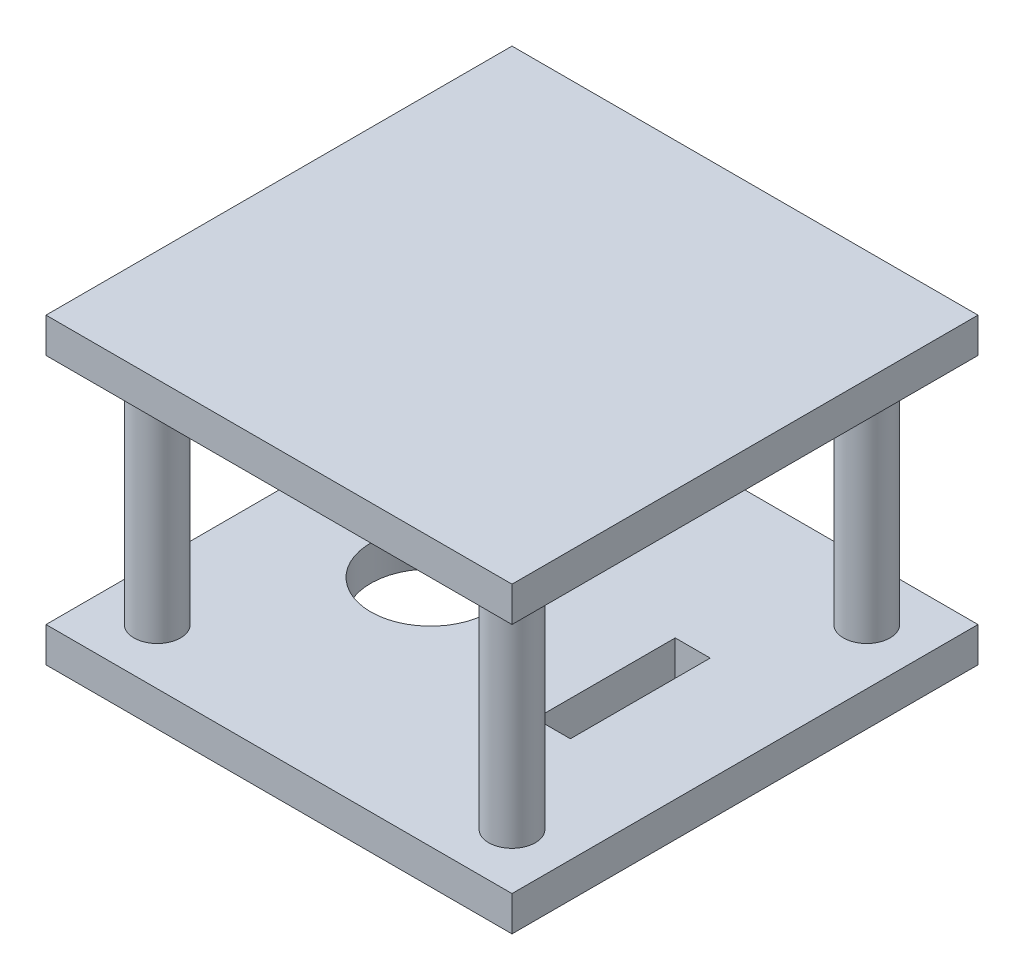
ISO-10303-21;
HEADER;
FILE_DESCRIPTION(('STEP AP214'),'2;1');
FILE_NAME('part.step','',(''),(''),'','','');
FILE_SCHEMA(('AUTOMOTIVE_DESIGN { 1 0 10303 214 1 1 1 1 }'));
ENDSEC;
DATA;
#1=APPLICATION_CONTEXT('core data for automotive mechanical design processes');
#2=APPLICATION_PROTOCOL_DEFINITION('international standard','automotive_design',2000,#1);
#3=PRODUCT_CONTEXT('',#1,'mechanical');
#4=PRODUCT('Part','Part','',(#3));
#5=PRODUCT_RELATED_PRODUCT_CATEGORY('part','',(#4));
#6=PRODUCT_DEFINITION_FORMATION('','',#4);
#7=PRODUCT_DEFINITION_CONTEXT('part definition',#1,'design');
#8=PRODUCT_DEFINITION('design','',#6,#7);
#9=PRODUCT_DEFINITION_SHAPE('','',#8);
#10=(LENGTH_UNIT() NAMED_UNIT(*) SI_UNIT(.MILLI.,.METRE.));
#11=(NAMED_UNIT(*) PLANE_ANGLE_UNIT() SI_UNIT($,.RADIAN.));
#12=(NAMED_UNIT(*) SI_UNIT($,.STERADIAN.) SOLID_ANGLE_UNIT());
#13=UNCERTAINTY_MEASURE_WITH_UNIT(LENGTH_MEASURE(1.E-05),#10,'distance_accuracy_value','');
#14=(GEOMETRIC_REPRESENTATION_CONTEXT(3) GLOBAL_UNCERTAINTY_ASSIGNED_CONTEXT((#13)) GLOBAL_UNIT_ASSIGNED_CONTEXT((#10,
#11,#12)) REPRESENTATION_CONTEXT('',''));
#15=CARTESIAN_POINT('',(0.,0.,0.));
#16=DIRECTION('',(0.,0.,1.));
#17=DIRECTION('',(1.,0.,0.));
#18=AXIS2_PLACEMENT_3D('',#15,#16,#17);
#19=CARTESIAN_POINT('',(-20.,3.,20.));
#20=DIRECTION('',(0.,0.,-1.));
#21=DIRECTION('',(-1.,0.,0.));
#22=AXIS2_PLACEMENT_3D('',#19,#20,#21);
#23=PLANE('',#22);
#24=DIRECTION('',(1.,0.,0.));
#25=VECTOR('',#24,1.);
#26=CARTESIAN_POINT('',(-20.,0.,20.));
#27=LINE('',#26,#25);
#28=CARTESIAN_POINT('',(-20.,0.,20.));
#29=VERTEX_POINT('',#28);
#30=CARTESIAN_POINT('',(20.,0.,20.));
#31=VERTEX_POINT('',#30);
#32=EDGE_CURVE('E214',#29,#31,#27,.T.);
#33=ORIENTED_EDGE('',*,*,#32,.T.);
#34=DIRECTION('',(0.,-1.,0.));
#35=VECTOR('',#34,1.);
#36=CARTESIAN_POINT('',(20.,3.,20.));
#37=LINE('',#36,#35);
#38=CARTESIAN_POINT('',(20.,3.,20.));
#39=VERTEX_POINT('',#38);
#40=EDGE_CURVE('E243',#39,#31,#37,.T.);
#41=ORIENTED_EDGE('',*,*,#40,.F.);
#42=DIRECTION('',(1.,0.,0.));
#43=VECTOR('',#42,1.);
#44=CARTESIAN_POINT('',(-20.,3.,20.));
#45=LINE('',#44,#43);
#46=CARTESIAN_POINT('',(-20.,3.,20.));
#47=VERTEX_POINT('',#46);
#48=EDGE_CURVE('E215',#47,#39,#45,.T.);
#49=ORIENTED_EDGE('',*,*,#48,.F.);
#50=DIRECTION('',(0.,-1.,0.));
#51=VECTOR('',#50,1.);
#52=CARTESIAN_POINT('',(-20.,3.,20.));
#53=LINE('',#52,#51);
#54=EDGE_CURVE('E227',#47,#29,#53,.T.);
#55=ORIENTED_EDGE('',*,*,#54,.T.);
#56=EDGE_LOOP('',(#33,#41,#49,#55));
#57=FACE_BOUND('',#56,.T.);
#58=ADVANCED_FACE('F39',(#57),#23,.F.);
#59=CARTESIAN_POINT('',(20.,3.,20.));
#60=DIRECTION('',(-1.,0.,0.));
#61=DIRECTION('',(0.,0.,1.));
#62=AXIS2_PLACEMENT_3D('',#59,#60,#61);
#63=PLANE('',#62);
#64=DIRECTION('',(0.,0.,-1.));
#65=VECTOR('',#64,1.);
#66=CARTESIAN_POINT('',(20.,0.,20.));
#67=LINE('',#66,#65);
#68=CARTESIAN_POINT('',(20.,0.,-20.));
#69=VERTEX_POINT('',#68);
#70=EDGE_CURVE('E230',#31,#69,#67,.T.);
#71=ORIENTED_EDGE('',*,*,#70,.T.);
#72=DIRECTION('',(0.,-1.,0.));
#73=VECTOR('',#72,1.);
#74=CARTESIAN_POINT('',(20.,3.,-20.));
#75=LINE('',#74,#73);
#76=CARTESIAN_POINT('',(20.,3.,-20.));
#77=VERTEX_POINT('',#76);
#78=EDGE_CURVE('E241',#77,#69,#75,.T.);
#79=ORIENTED_EDGE('',*,*,#78,.F.);
#80=DIRECTION('',(0.,0.,-1.));
#81=VECTOR('',#80,1.);
#82=CARTESIAN_POINT('',(20.,3.,20.));
#83=LINE('',#82,#81);
#84=EDGE_CURVE('E218',#39,#77,#83,.T.);
#85=ORIENTED_EDGE('',*,*,#84,.F.);
#86=ORIENTED_EDGE('',*,*,#40,.T.);
#87=EDGE_LOOP('',(#71,#79,#85,#86));
#88=FACE_BOUND('',#87,.T.);
#89=ADVANCED_FACE('F283',(#88),#63,.F.);
#90=CARTESIAN_POINT('',(-20.,3.,-20.));
#91=DIRECTION('',(0.,0.,-1.));
#92=DIRECTION('',(-1.,0.,0.));
#93=AXIS2_PLACEMENT_3D('',#90,#91,#92);
#94=PLANE('',#93);
#95=DIRECTION('',(1.,0.,0.));
#96=VECTOR('',#95,1.);
#97=CARTESIAN_POINT('',(-20.,0.,-20.));
#98=LINE('',#97,#96);
#99=CARTESIAN_POINT('',(-20.,0.,-20.));
#100=VERTEX_POINT('',#99);
#101=EDGE_CURVE('E233',#100,#69,#98,.T.);
#102=ORIENTED_EDGE('',*,*,#101,.F.);
#103=DIRECTION('',(0.,-1.,0.));
#104=VECTOR('',#103,1.);
#105=CARTESIAN_POINT('',(-20.,3.,-20.));
#106=LINE('',#105,#104);
#107=CARTESIAN_POINT('',(-20.,3.,-20.));
#108=VERTEX_POINT('',#107);
#109=EDGE_CURVE('E239',#108,#100,#106,.T.);
#110=ORIENTED_EDGE('',*,*,#109,.F.);
#111=DIRECTION('',(1.,0.,0.));
#112=VECTOR('',#111,1.);
#113=CARTESIAN_POINT('',(-20.,3.,-20.));
#114=LINE('',#113,#112);
#115=EDGE_CURVE('E221',#108,#77,#114,.T.);
#116=ORIENTED_EDGE('',*,*,#115,.T.);
#117=ORIENTED_EDGE('',*,*,#78,.T.);
#118=EDGE_LOOP('',(#102,#110,#116,#117));
#119=FACE_BOUND('',#118,.T.);
#120=ADVANCED_FACE('F280',(#119),#94,.T.);
#121=CARTESIAN_POINT('',(-20.,3.,20.));
#122=DIRECTION('',(-1.,0.,0.));
#123=DIRECTION('',(0.,0.,1.));
#124=AXIS2_PLACEMENT_3D('',#121,#122,#123);
#125=PLANE('',#124);
#126=DIRECTION('',(0.,0.,-1.));
#127=VECTOR('',#126,1.);
#128=CARTESIAN_POINT('',(-20.,0.,20.));
#129=LINE('',#128,#127);
#130=EDGE_CURVE('E219',#29,#100,#129,.T.);
#131=ORIENTED_EDGE('',*,*,#130,.F.);
#132=ORIENTED_EDGE('',*,*,#54,.F.);
#133=DIRECTION('',(0.,0.,-1.));
#134=VECTOR('',#133,1.);
#135=CARTESIAN_POINT('',(-20.,3.,20.));
#136=LINE('',#135,#134);
#137=EDGE_CURVE('E224',#47,#108,#136,.T.);
#138=ORIENTED_EDGE('',*,*,#137,.T.);
#139=ORIENTED_EDGE('',*,*,#109,.T.);
#140=EDGE_LOOP('',(#131,#132,#138,#139));
#141=FACE_BOUND('',#140,.T.);
#142=ADVANCED_FACE('F274',(#141),#125,.T.);
#143=CARTESIAN_POINT('',(0.,3.,0.));
#144=DIRECTION('',(0.,1.,0.));
#145=DIRECTION('',(0.,0.,1.));
#146=AXIS2_PLACEMENT_3D('',#143,#144,#145);
#147=PLANE('',#146);
#148=CARTESIAN_POINT('',(15.2247989874837,3.,15.2247989874837));
#149=DIRECTION('',(0.,1.,0.));
#150=DIRECTION('',(0.,0.,1.));
#151=AXIS2_PLACEMENT_3D('',#148,#149,#150);
#152=CIRCLE('',#151,2.);
#153=CARTESIAN_POINT('',(15.2247989874837,3.,17.2247989874837));
#154=VERTEX_POINT('',#153);
#155=EDGE_CURVE('E197',#154,#154,#152,.T.);
#156=ORIENTED_EDGE('',*,*,#155,.F.);
#157=EDGE_LOOP('',(#156));
#158=FACE_BOUND('',#157,.T.);
#159=CARTESIAN_POINT('',(15.2247989874837,3.,-15.2247989874837));
#160=DIRECTION('',(0.,1.,0.));
#161=DIRECTION('',(0.,0.,1.));
#162=AXIS2_PLACEMENT_3D('',#159,#160,#161);
#163=CIRCLE('',#162,2.);
#164=CARTESIAN_POINT('',(15.2247989874837,3.,-13.2247989874837));
#165=VERTEX_POINT('',#164);
#166=EDGE_CURVE('E201',#165,#165,#163,.T.);
#167=ORIENTED_EDGE('',*,*,#166,.F.);
#168=EDGE_LOOP('',(#167));
#169=FACE_BOUND('',#168,.T.);
#170=CARTESIAN_POINT('',(-15.2247989874837,3.,-15.2247989874837));
#171=DIRECTION('',(0.,1.,0.));
#172=DIRECTION('',(0.,0.,1.));
#173=AXIS2_PLACEMENT_3D('',#170,#171,#172);
#174=CIRCLE('',#173,2.);
#175=CARTESIAN_POINT('',(-15.2247989874837,3.,-13.2247989874837));
#176=VERTEX_POINT('',#175);
#177=EDGE_CURVE('E204',#176,#176,#174,.T.);
#178=ORIENTED_EDGE('',*,*,#177,.F.);
#179=EDGE_LOOP('',(#178));
#180=FACE_BOUND('',#179,.T.);
#181=CARTESIAN_POINT('',(-7.,3.,0.));
#182=DIRECTION('',(0.,1.,0.));
#183=DIRECTION('',(0.,0.,1.));
#184=AXIS2_PLACEMENT_3D('',#181,#182,#183);
#185=CIRCLE('',#184,5.125);
#186=CARTESIAN_POINT('',(-7.,3.,5.125));
#187=VERTEX_POINT('',#186);
#188=EDGE_CURVE('E207',#187,#187,#185,.T.);
#189=ORIENTED_EDGE('',*,*,#188,.F.);
#190=EDGE_LOOP('',(#189));
#191=FACE_BOUND('',#190,.T.);
#192=DIRECTION('',(1.,0.,0.));
#193=VECTOR('',#192,1.);
#194=CARTESIAN_POINT('',(8.,3.,5.9883944628134));
#195=LINE('',#194,#193);
#196=CARTESIAN_POINT('',(8.,3.,5.9883944628134));
#197=VERTEX_POINT('',#196);
#198=CARTESIAN_POINT('',(11.,3.,5.9883944628134));
#199=VERTEX_POINT('',#198);
#200=EDGE_CURVE('E173',#197,#199,#195,.T.);
#201=ORIENTED_EDGE('',*,*,#200,.F.);
#202=DIRECTION('',(0.,0.,1.));
#203=VECTOR('',#202,1.);
#204=CARTESIAN_POINT('',(8.,3.,-6.0116055371866));
#205=LINE('',#204,#203);
#206=CARTESIAN_POINT('',(8.,3.,-6.0116055371866));
#207=VERTEX_POINT('',#206);
#208=EDGE_CURVE('E171',#207,#197,#205,.T.);
#209=ORIENTED_EDGE('',*,*,#208,.F.);
#210=DIRECTION('',(-1.,0.,0.));
#211=VECTOR('',#210,1.);
#212=CARTESIAN_POINT('',(8.,3.,-6.0116055371866));
#213=LINE('',#212,#211);
#214=CARTESIAN_POINT('',(11.,3.,-6.0116055371866));
#215=VERTEX_POINT('',#214);
#216=EDGE_CURVE('E178',#215,#207,#213,.T.);
#217=ORIENTED_EDGE('',*,*,#216,.F.);
#218=DIRECTION('',(0.,0.,-1.));
#219=VECTOR('',#218,1.);
#220=CARTESIAN_POINT('',(11.,3.,-6.0116055371866));
#221=LINE('',#220,#219);
#222=EDGE_CURVE('E176',#199,#215,#221,.T.);
#223=ORIENTED_EDGE('',*,*,#222,.F.);
#224=EDGE_LOOP('',(#201,#209,#217,#223));
#225=FACE_BOUND('',#224,.T.);
#226=CARTESIAN_POINT('',(-15.2247989874837,3.,15.2247989874837));
#227=DIRECTION('',(0.,1.,0.));
#228=DIRECTION('',(0.,0.,1.));
#229=AXIS2_PLACEMENT_3D('',#226,#227,#228);
#230=CIRCLE('',#229,2.);
#231=CARTESIAN_POINT('',(-15.2247989874837,3.,17.2247989874837));
#232=VERTEX_POINT('',#231);
#233=EDGE_CURVE('E200',#232,#232,#230,.T.);
#234=ORIENTED_EDGE('',*,*,#233,.F.);
#235=EDGE_LOOP('',(#234));
#236=FACE_BOUND('',#235,.T.);
#237=ORIENTED_EDGE('',*,*,#48,.T.);
#238=ORIENTED_EDGE('',*,*,#84,.T.);
#239=ORIENTED_EDGE('',*,*,#115,.F.);
#240=ORIENTED_EDGE('',*,*,#137,.F.);
#241=EDGE_LOOP('',(#237,#238,#239,#240));
#242=FACE_BOUND('',#241,.T.);
#243=ADVANCED_FACE('F257',(#158,#169,#180,#191,#225,#236,#242),#147,.T.);
#244=CARTESIAN_POINT('',(0.,0.,0.));
#245=DIRECTION('',(0.,1.,0.));
#246=DIRECTION('',(0.,0.,1.));
#247=AXIS2_PLACEMENT_3D('',#244,#245,#246);
#248=PLANE('',#247);
#249=CARTESIAN_POINT('',(15.2247989874837,0.,15.2247989874837));
#250=DIRECTION('',(0.,1.,0.));
#251=DIRECTION('',(0.,0.,1.));
#252=AXIS2_PLACEMENT_3D('',#249,#250,#251);
#253=CIRCLE('',#252,2.);
#254=CARTESIAN_POINT('',(15.2247989874837,0.,17.2247989874837));
#255=VERTEX_POINT('',#254);
#256=EDGE_CURVE('E11',#255,#255,#253,.F.);
#257=ORIENTED_EDGE('',*,*,#256,.F.);
#258=EDGE_LOOP('',(#257));
#259=FACE_BOUND('',#258,.T.);
#260=CARTESIAN_POINT('',(-15.2247989874837,0.,15.2247989874837));
#261=DIRECTION('',(0.,1.,0.));
#262=DIRECTION('',(0.,0.,1.));
#263=AXIS2_PLACEMENT_3D('',#260,#261,#262);
#264=CIRCLE('',#263,2.);
#265=CARTESIAN_POINT('',(-15.2247989874837,0.,17.2247989874837));
#266=VERTEX_POINT('',#265);
#267=EDGE_CURVE('E46',#266,#266,#264,.F.);
#268=ORIENTED_EDGE('',*,*,#267,.F.);
#269=EDGE_LOOP('',(#268));
#270=FACE_BOUND('',#269,.T.);
#271=CARTESIAN_POINT('',(-15.2247989874837,0.,-15.2247989874837));
#272=DIRECTION('',(0.,1.,0.));
#273=DIRECTION('',(0.,0.,1.));
#274=AXIS2_PLACEMENT_3D('',#271,#272,#273);
#275=CIRCLE('',#274,2.);
#276=CARTESIAN_POINT('',(-15.2247989874837,0.,-13.2247989874837));
#277=VERTEX_POINT('',#276);
#278=EDGE_CURVE('E246',#277,#277,#275,.F.);
#279=ORIENTED_EDGE('',*,*,#278,.F.);
#280=EDGE_LOOP('',(#279));
#281=FACE_BOUND('',#280,.T.);
#282=CARTESIAN_POINT('',(15.2247989874837,0.,-15.2247989874837));
#283=DIRECTION('',(0.,1.,0.));
#284=DIRECTION('',(0.,0.,1.));
#285=AXIS2_PLACEMENT_3D('',#282,#283,#284);
#286=CIRCLE('',#285,2.);
#287=CARTESIAN_POINT('',(15.2247989874837,0.,-13.2247989874837));
#288=VERTEX_POINT('',#287);
#289=EDGE_CURVE('E265',#288,#288,#286,.T.);
#290=ORIENTED_EDGE('',*,*,#289,.T.);
#291=EDGE_LOOP('',(#290));
#292=FACE_BOUND('',#291,.T.);
#293=CARTESIAN_POINT('',(-7.,0.,0.));
#294=DIRECTION('',(0.,1.,0.));
#295=DIRECTION('',(0.,0.,1.));
#296=AXIS2_PLACEMENT_3D('',#293,#294,#295);
#297=CIRCLE('',#296,5.125);
#298=CARTESIAN_POINT('',(-7.,0.,5.125));
#299=VERTEX_POINT('',#298);
#300=EDGE_CURVE('E196',#299,#299,#297,.T.);
#301=ORIENTED_EDGE('',*,*,#300,.T.);
#302=EDGE_LOOP('',(#301));
#303=FACE_BOUND('',#302,.T.);
#304=DIRECTION('',(0.,0.,1.));
#305=VECTOR('',#304,1.);
#306=CARTESIAN_POINT('',(8.,0.,-6.0116055371866));
#307=LINE('',#306,#305);
#308=CARTESIAN_POINT('',(8.,0.,-6.0116055371866));
#309=VERTEX_POINT('',#308);
#310=CARTESIAN_POINT('',(8.,0.,5.9883944628134));
#311=VERTEX_POINT('',#310);
#312=EDGE_CURVE('E61',#309,#311,#307,.T.);
#313=ORIENTED_EDGE('',*,*,#312,.T.);
#314=DIRECTION('',(1.,0.,0.));
#315=VECTOR('',#314,1.);
#316=CARTESIAN_POINT('',(8.,0.,5.9883944628134));
#317=LINE('',#316,#315);
#318=CARTESIAN_POINT('',(11.,0.,5.9883944628134));
#319=VERTEX_POINT('',#318);
#320=EDGE_CURVE('E182',#311,#319,#317,.T.);
#321=ORIENTED_EDGE('',*,*,#320,.T.);
#322=DIRECTION('',(0.,0.,-1.));
#323=VECTOR('',#322,1.);
#324=CARTESIAN_POINT('',(11.,0.,-6.0116055371866));
#325=LINE('',#324,#323);
#326=CARTESIAN_POINT('',(11.,0.,-6.0116055371866));
#327=VERTEX_POINT('',#326);
#328=EDGE_CURVE('E185',#319,#327,#325,.T.);
#329=ORIENTED_EDGE('',*,*,#328,.T.);
#330=DIRECTION('',(-1.,0.,0.));
#331=VECTOR('',#330,1.);
#332=CARTESIAN_POINT('',(8.,0.,-6.0116055371866));
#333=LINE('',#332,#331);
#334=EDGE_CURVE('E174',#327,#309,#333,.T.);
#335=ORIENTED_EDGE('',*,*,#334,.T.);
#336=EDGE_LOOP('',(#313,#321,#329,#335));
#337=FACE_BOUND('',#336,.T.);
#338=ORIENTED_EDGE('',*,*,#32,.F.);
#339=ORIENTED_EDGE('',*,*,#130,.T.);
#340=ORIENTED_EDGE('',*,*,#101,.T.);
#341=ORIENTED_EDGE('',*,*,#70,.F.);
#342=EDGE_LOOP('',(#338,#339,#340,#341));
#343=FACE_BOUND('',#342,.T.);
#344=ADVANCED_FACE('F253',(#259,#270,#281,#292,#303,#337,#343),#248,.F.);
#345=CARTESIAN_POINT('',(8.,3.,-6.0116055371866));
#346=DIRECTION('',(1.,0.,0.));
#347=DIRECTION('',(0.,0.,-1.));
#348=AXIS2_PLACEMENT_3D('',#345,#346,#347);
#349=PLANE('',#348);
#350=ORIENTED_EDGE('',*,*,#312,.F.);
#351=DIRECTION('',(0.,-1.,0.));
#352=VECTOR('',#351,1.);
#353=CARTESIAN_POINT('',(8.,3.,-6.0116055371866));
#354=LINE('',#353,#352);
#355=EDGE_CURVE('E180',#207,#309,#354,.T.);
#356=ORIENTED_EDGE('',*,*,#355,.F.);
#357=ORIENTED_EDGE('',*,*,#208,.T.);
#358=DIRECTION('',(0.,-1.,0.));
#359=VECTOR('',#358,1.);
#360=CARTESIAN_POINT('',(8.,3.,5.9883944628134));
#361=LINE('',#360,#359);
#362=EDGE_CURVE('E194',#197,#311,#361,.T.);
#363=ORIENTED_EDGE('',*,*,#362,.T.);
#364=EDGE_LOOP('',(#350,#356,#357,#363));
#365=FACE_BOUND('',#364,.T.);
#366=ADVANCED_FACE('F256',(#365),#349,.T.);
#367=CARTESIAN_POINT('',(8.,3.,5.9883944628134));
#368=DIRECTION('',(0.,0.,-1.));
#369=DIRECTION('',(-1.,0.,0.));
#370=AXIS2_PLACEMENT_3D('',#367,#368,#369);
#371=PLANE('',#370);
#372=ORIENTED_EDGE('',*,*,#320,.F.);
#373=ORIENTED_EDGE('',*,*,#362,.F.);
#374=ORIENTED_EDGE('',*,*,#200,.T.);
#375=DIRECTION('',(0.,-1.,0.));
#376=VECTOR('',#375,1.);
#377=CARTESIAN_POINT('',(11.,3.,5.9883944628134));
#378=LINE('',#377,#376);
#379=EDGE_CURVE('E192',#199,#319,#378,.T.);
#380=ORIENTED_EDGE('',*,*,#379,.T.);
#381=EDGE_LOOP('',(#372,#373,#374,#380));
#382=FACE_BOUND('',#381,.T.);
#383=ADVANCED_FACE('F323',(#382),#371,.T.);
#384=CARTESIAN_POINT('',(11.,3.,-6.0116055371866));
#385=DIRECTION('',(-1.,0.,0.));
#386=DIRECTION('',(0.,0.,1.));
#387=AXIS2_PLACEMENT_3D('',#384,#385,#386);
#388=PLANE('',#387);
#389=ORIENTED_EDGE('',*,*,#328,.F.);
#390=ORIENTED_EDGE('',*,*,#379,.F.);
#391=ORIENTED_EDGE('',*,*,#222,.T.);
#392=DIRECTION('',(0.,-1.,0.));
#393=VECTOR('',#392,1.);
#394=CARTESIAN_POINT('',(11.,3.,-6.0116055371866));
#395=LINE('',#394,#393);
#396=EDGE_CURVE('E53',#215,#327,#395,.T.);
#397=ORIENTED_EDGE('',*,*,#396,.T.);
#398=EDGE_LOOP('',(#389,#390,#391,#397));
#399=FACE_BOUND('',#398,.T.);
#400=ADVANCED_FACE('F332',(#399),#388,.T.);
#401=CARTESIAN_POINT('',(8.,3.,-6.0116055371866));
#402=DIRECTION('',(0.,0.,1.));
#403=DIRECTION('',(1.,0.,0.));
#404=AXIS2_PLACEMENT_3D('',#401,#402,#403);
#405=PLANE('',#404);
#406=ORIENTED_EDGE('',*,*,#334,.F.);
#407=ORIENTED_EDGE('',*,*,#396,.F.);
#408=ORIENTED_EDGE('',*,*,#216,.T.);
#409=ORIENTED_EDGE('',*,*,#355,.T.);
#410=EDGE_LOOP('',(#406,#407,#408,#409));
#411=FACE_BOUND('',#410,.T.);
#412=ADVANCED_FACE('F342',(#411),#405,.T.);
#413=CARTESIAN_POINT('',(-7.,3.,0.));
#414=DIRECTION('',(0.,-1.,0.));
#415=DIRECTION('',(0.,0.,-1.));
#416=AXIS2_PLACEMENT_3D('',#413,#414,#415);
#417=CYLINDRICAL_SURFACE('',#416,5.125);
#418=ORIENTED_EDGE('',*,*,#188,.T.);
#419=EDGE_LOOP('',(#418));
#420=FACE_BOUND('',#419,.T.);
#421=ORIENTED_EDGE('',*,*,#300,.F.);
#422=EDGE_LOOP('',(#421));
#423=FACE_BOUND('',#422,.T.);
#424=ADVANCED_FACE('F352',(#420,#423),#417,.F.);
#425=CARTESIAN_POINT('',(20.,26.,20.));
#426=DIRECTION('',(-1.,0.,0.));
#427=DIRECTION('',(0.,0.,1.));
#428=AXIS2_PLACEMENT_3D('',#425,#426,#427);
#429=PLANE('',#428);
#430=DIRECTION('',(0.,0.,-1.));
#431=VECTOR('',#430,1.);
#432=CARTESIAN_POINT('',(20.,23.,20.));
#433=LINE('',#432,#431);
#434=CARTESIAN_POINT('',(20.,23.,20.));
#435=VERTEX_POINT('',#434);
#436=CARTESIAN_POINT('',(20.,23.,-20.));
#437=VERTEX_POINT('',#436);
#438=EDGE_CURVE('E153',#435,#437,#433,.T.);
#439=ORIENTED_EDGE('',*,*,#438,.T.);
#440=DIRECTION('',(0.,-1.,0.));
#441=VECTOR('',#440,1.);
#442=CARTESIAN_POINT('',(20.,26.,-20.));
#443=LINE('',#442,#441);
#444=CARTESIAN_POINT('',(20.,26.,-20.));
#445=VERTEX_POINT('',#444);
#446=EDGE_CURVE('E133',#445,#437,#443,.T.);
#447=ORIENTED_EDGE('',*,*,#446,.F.);
#448=DIRECTION('',(0.,0.,-1.));
#449=VECTOR('',#448,1.);
#450=CARTESIAN_POINT('',(20.,26.,20.));
#451=LINE('',#450,#449);
#452=CARTESIAN_POINT('',(20.,26.,20.));
#453=VERTEX_POINT('',#452);
#454=EDGE_CURVE('E140',#453,#445,#451,.T.);
#455=ORIENTED_EDGE('',*,*,#454,.F.);
#456=DIRECTION('',(0.,-1.,0.));
#457=VECTOR('',#456,1.);
#458=CARTESIAN_POINT('',(20.,26.,20.));
#459=LINE('',#458,#457);
#460=EDGE_CURVE('E562',#453,#435,#459,.T.);
#461=ORIENTED_EDGE('',*,*,#460,.T.);
#462=EDGE_LOOP('',(#439,#447,#455,#461));
#463=FACE_BOUND('',#462,.T.);
#464=ADVANCED_FACE('F151',(#463),#429,.F.);
#465=CARTESIAN_POINT('',(20.,26.,-20.));
#466=DIRECTION('',(0.,0.,1.));
#467=DIRECTION('',(1.,0.,0.));
#468=AXIS2_PLACEMENT_3D('',#465,#466,#467);
#469=PLANE('',#468);
#470=DIRECTION('',(-1.,0.,0.));
#471=VECTOR('',#470,1.);
#472=CARTESIAN_POINT('',(20.,23.,-20.));
#473=LINE('',#472,#471);
#474=CARTESIAN_POINT('',(-20.,23.,-20.));
#475=VERTEX_POINT('',#474);
#476=EDGE_CURVE('E564',#437,#475,#473,.T.);
#477=ORIENTED_EDGE('',*,*,#476,.T.);
#478=DIRECTION('',(0.,-1.,0.));
#479=VECTOR('',#478,1.);
#480=CARTESIAN_POINT('',(-20.,26.,-20.));
#481=LINE('',#480,#479);
#482=CARTESIAN_POINT('',(-20.,26.,-20.));
#483=VERTEX_POINT('',#482);
#484=EDGE_CURVE('E136',#483,#475,#481,.T.);
#485=ORIENTED_EDGE('',*,*,#484,.F.);
#486=DIRECTION('',(-1.,0.,0.));
#487=VECTOR('',#486,1.);
#488=CARTESIAN_POINT('',(20.,26.,-20.));
#489=LINE('',#488,#487);
#490=EDGE_CURVE('E129',#445,#483,#489,.T.);
#491=ORIENTED_EDGE('',*,*,#490,.F.);
#492=ORIENTED_EDGE('',*,*,#446,.T.);
#493=EDGE_LOOP('',(#477,#485,#491,#492));
#494=FACE_BOUND('',#493,.T.);
#495=ADVANCED_FACE('F131',(#494),#469,.F.);
#496=CARTESIAN_POINT('',(-20.,26.,20.));
#497=DIRECTION('',(1.,0.,0.));
#498=DIRECTION('',(0.,0.,-1.));
#499=AXIS2_PLACEMENT_3D('',#496,#497,#498);
#500=PLANE('',#499);
#501=DIRECTION('',(0.,0.,1.));
#502=VECTOR('',#501,1.);
#503=CARTESIAN_POINT('',(-20.,23.,20.));
#504=LINE('',#503,#502);
#505=CARTESIAN_POINT('',(-20.,23.,20.));
#506=VERTEX_POINT('',#505);
#507=EDGE_CURVE('E566',#475,#506,#504,.T.);
#508=ORIENTED_EDGE('',*,*,#507,.T.);
#509=DIRECTION('',(0.,-1.,0.));
#510=VECTOR('',#509,1.);
#511=CARTESIAN_POINT('',(-20.,26.,20.));
#512=LINE('',#511,#510);
#513=CARTESIAN_POINT('',(-20.,26.,20.));
#514=VERTEX_POINT('',#513);
#515=EDGE_CURVE('E159',#514,#506,#512,.T.);
#516=ORIENTED_EDGE('',*,*,#515,.F.);
#517=DIRECTION('',(0.,0.,1.));
#518=VECTOR('',#517,1.);
#519=CARTESIAN_POINT('',(-20.,26.,20.));
#520=LINE('',#519,#518);
#521=EDGE_CURVE('E139',#483,#514,#520,.T.);
#522=ORIENTED_EDGE('',*,*,#521,.F.);
#523=ORIENTED_EDGE('',*,*,#484,.T.);
#524=EDGE_LOOP('',(#508,#516,#522,#523));
#525=FACE_BOUND('',#524,.T.);
#526=ADVANCED_FACE('F385',(#525),#500,.F.);
#527=CARTESIAN_POINT('',(20.,26.,20.));
#528=DIRECTION('',(0.,0.,-1.));
#529=DIRECTION('',(-1.,0.,0.));
#530=AXIS2_PLACEMENT_3D('',#527,#528,#529);
#531=PLANE('',#530);
#532=DIRECTION('',(1.,0.,0.));
#533=VECTOR('',#532,1.);
#534=CARTESIAN_POINT('',(20.,23.,20.));
#535=LINE('',#534,#533);
#536=EDGE_CURVE('E149',#506,#435,#535,.T.);
#537=ORIENTED_EDGE('',*,*,#536,.T.);
#538=ORIENTED_EDGE('',*,*,#460,.F.);
#539=DIRECTION('',(1.,0.,0.));
#540=VECTOR('',#539,1.);
#541=CARTESIAN_POINT('',(20.,26.,20.));
#542=LINE('',#541,#540);
#543=EDGE_CURVE('E145',#514,#453,#542,.T.);
#544=ORIENTED_EDGE('',*,*,#543,.F.);
#545=ORIENTED_EDGE('',*,*,#515,.T.);
#546=EDGE_LOOP('',(#537,#538,#544,#545));
#547=FACE_BOUND('',#546,.T.);
#548=ADVANCED_FACE('F394',(#547),#531,.F.);
#549=CARTESIAN_POINT('',(0.,26.,0.));
#550=DIRECTION('',(0.,1.,0.));
#551=DIRECTION('',(0.,0.,1.));
#552=AXIS2_PLACEMENT_3D('',#549,#550,#551);
#553=PLANE('',#552);
#554=ORIENTED_EDGE('',*,*,#454,.T.);
#555=ORIENTED_EDGE('',*,*,#490,.T.);
#556=ORIENTED_EDGE('',*,*,#521,.T.);
#557=ORIENTED_EDGE('',*,*,#543,.T.);
#558=EDGE_LOOP('',(#554,#555,#556,#557));
#559=FACE_BOUND('',#558,.T.);
#560=ADVANCED_FACE('F143',(#559),#553,.T.);
#561=CARTESIAN_POINT('',(0.,23.,0.));
#562=DIRECTION('',(0.,1.,0.));
#563=DIRECTION('',(0.,0.,1.));
#564=AXIS2_PLACEMENT_3D('',#561,#562,#563);
#565=PLANE('',#564);
#566=CARTESIAN_POINT('',(15.2247989874837,23.,15.2247989874837));
#567=DIRECTION('',(0.,1.,0.));
#568=DIRECTION('',(0.,0.,1.));
#569=AXIS2_PLACEMENT_3D('',#566,#567,#568);
#570=CIRCLE('',#569,2.);
#571=CARTESIAN_POINT('',(15.2247989874837,23.,17.2247989874837));
#572=VERTEX_POINT('',#571);
#573=EDGE_CURVE('E168',#572,#572,#570,.F.);
#574=ORIENTED_EDGE('',*,*,#573,.F.);
#575=EDGE_LOOP('',(#574));
#576=FACE_BOUND('',#575,.T.);
#577=CARTESIAN_POINT('',(15.2247989874837,23.,-15.2247989874837));
#578=DIRECTION('',(0.,1.,0.));
#579=DIRECTION('',(0.,0.,1.));
#580=AXIS2_PLACEMENT_3D('',#577,#578,#579);
#581=CIRCLE('',#580,2.);
#582=CARTESIAN_POINT('',(15.2247989874837,23.,-13.2247989874837));
#583=VERTEX_POINT('',#582);
#584=EDGE_CURVE('E165',#583,#583,#581,.F.);
#585=ORIENTED_EDGE('',*,*,#584,.F.);
#586=EDGE_LOOP('',(#585));
#587=FACE_BOUND('',#586,.T.);
#588=CARTESIAN_POINT('',(-15.2247989874837,23.,-15.2247989874837));
#589=DIRECTION('',(0.,1.,0.));
#590=DIRECTION('',(0.,0.,1.));
#591=AXIS2_PLACEMENT_3D('',#588,#589,#590);
#592=CIRCLE('',#591,2.);
#593=CARTESIAN_POINT('',(-15.2247989874837,23.,-13.2247989874837));
#594=VERTEX_POINT('',#593);
#595=EDGE_CURVE('E157',#594,#594,#592,.F.);
#596=ORIENTED_EDGE('',*,*,#595,.F.);
#597=EDGE_LOOP('',(#596));
#598=FACE_BOUND('',#597,.T.);
#599=CARTESIAN_POINT('',(-15.2247989874837,23.,15.2247989874837));
#600=DIRECTION('',(0.,1.,0.));
#601=DIRECTION('',(0.,0.,1.));
#602=AXIS2_PLACEMENT_3D('',#599,#600,#601);
#603=CIRCLE('',#602,2.);
#604=CARTESIAN_POINT('',(-15.2247989874837,23.,17.2247989874837));
#605=VERTEX_POINT('',#604);
#606=EDGE_CURVE('E154',#605,#605,#603,.F.);
#607=ORIENTED_EDGE('',*,*,#606,.F.);
#608=EDGE_LOOP('',(#607));
#609=FACE_BOUND('',#608,.T.);
#610=ORIENTED_EDGE('',*,*,#438,.F.);
#611=ORIENTED_EDGE('',*,*,#536,.F.);
#612=ORIENTED_EDGE('',*,*,#507,.F.);
#613=ORIENTED_EDGE('',*,*,#476,.F.);
#614=EDGE_LOOP('',(#610,#611,#612,#613));
#615=FACE_BOUND('',#614,.T.);
#616=ADVANCED_FACE('F413',(#576,#587,#598,#609,#615),#565,.F.);
#617=CARTESIAN_POINT('',(-15.2247989874837,24.,15.2247989874837));
#618=DIRECTION('',(0.,-1.,0.));
#619=DIRECTION('',(0.,0.,-1.));
#620=AXIS2_PLACEMENT_3D('',#617,#618,#619);
#621=CYLINDRICAL_SURFACE('',#620,2.);
#622=ORIENTED_EDGE('',*,*,#233,.T.);
#623=EDGE_LOOP('',(#622));
#624=FACE_BOUND('',#623,.T.);
#625=ORIENTED_EDGE('',*,*,#606,.T.);
#626=EDGE_LOOP('',(#625));
#627=FACE_BOUND('',#626,.T.);
#628=ADVANCED_FACE('F422',(#624,#627),#621,.T.);
#629=CARTESIAN_POINT('',(-15.2247989874837,24.,-15.2247989874837));
#630=DIRECTION('',(0.,-1.,0.));
#631=DIRECTION('',(0.,0.,-1.));
#632=AXIS2_PLACEMENT_3D('',#629,#630,#631);
#633=CYLINDRICAL_SURFACE('',#632,2.);
#634=ORIENTED_EDGE('',*,*,#177,.T.);
#635=EDGE_LOOP('',(#634));
#636=FACE_BOUND('',#635,.T.);
#637=ORIENTED_EDGE('',*,*,#595,.T.);
#638=EDGE_LOOP('',(#637));
#639=FACE_BOUND('',#638,.T.);
#640=ADVANCED_FACE('F432',(#636,#639),#633,.T.);
#641=CARTESIAN_POINT('',(15.2247989874837,24.,-15.2247989874837));
#642=DIRECTION('',(0.,-1.,0.));
#643=DIRECTION('',(0.,0.,-1.));
#644=AXIS2_PLACEMENT_3D('',#641,#642,#643);
#645=CYLINDRICAL_SURFACE('',#644,2.);
#646=ORIENTED_EDGE('',*,*,#166,.T.);
#647=EDGE_LOOP('',(#646));
#648=FACE_BOUND('',#647,.T.);
#649=ORIENTED_EDGE('',*,*,#584,.T.);
#650=EDGE_LOOP('',(#649));
#651=FACE_BOUND('',#650,.T.);
#652=ADVANCED_FACE('F442',(#648,#651),#645,.T.);
#653=CARTESIAN_POINT('',(15.2247989874837,24.,15.2247989874837));
#654=DIRECTION('',(0.,-1.,0.));
#655=DIRECTION('',(0.,0.,-1.));
#656=AXIS2_PLACEMENT_3D('',#653,#654,#655);
#657=CYLINDRICAL_SURFACE('',#656,2.);
#658=ORIENTED_EDGE('',*,*,#155,.T.);
#659=EDGE_LOOP('',(#658));
#660=FACE_BOUND('',#659,.T.);
#661=ORIENTED_EDGE('',*,*,#573,.T.);
#662=EDGE_LOOP('',(#661));
#663=FACE_BOUND('',#662,.T.);
#664=ADVANCED_FACE('F452',(#660,#663),#657,.T.);
#665=CARTESIAN_POINT('',(15.2247989874837,-2.,-15.2247989874837));
#666=DIRECTION('',(0.,1.,0.));
#667=DIRECTION('',(0.,0.,1.));
#668=AXIS2_PLACEMENT_3D('',#665,#666,#667);
#669=CYLINDRICAL_SURFACE('',#668,2.);
#670=CARTESIAN_POINT('',(15.2247989874837,-2.,-15.2247989874837));
#671=DIRECTION('',(0.,1.,0.));
#672=DIRECTION('',(0.,0.,1.));
#673=AXIS2_PLACEMENT_3D('',#670,#671,#672);
#674=CIRCLE('',#673,2.);
#675=CARTESIAN_POINT('',(15.2247989874837,-2.,-13.2247989874837));
#676=VERTEX_POINT('',#675);
#677=EDGE_CURVE('E556',#676,#676,#674,.T.);
#678=ORIENTED_EDGE('',*,*,#677,.T.);
#679=EDGE_LOOP('',(#678));
#680=FACE_BOUND('',#679,.T.);
#681=ORIENTED_EDGE('',*,*,#289,.F.);
#682=EDGE_LOOP('',(#681));
#683=FACE_BOUND('',#682,.T.);
#684=ADVANCED_FACE('F462',(#680,#683),#669,.T.);
#685=CARTESIAN_POINT('',(15.2247989874837,-2.,-15.2247989874837));
#686=DIRECTION('',(0.,1.,0.));
#687=DIRECTION('',(0.,0.,1.));
#688=AXIS2_PLACEMENT_3D('',#685,#686,#687);
#689=PLANE('',#688);
#690=ORIENTED_EDGE('',*,*,#677,.F.);
#691=EDGE_LOOP('',(#690));
#692=FACE_BOUND('',#691,.T.);
#693=ADVANCED_FACE('F472',(#692),#689,.F.);
#694=CARTESIAN_POINT('',(-15.2247989874837,-2.,-15.2247989874837));
#695=DIRECTION('',(0.,1.,0.));
#696=DIRECTION('',(0.,0.,1.));
#697=AXIS2_PLACEMENT_3D('',#694,#695,#696);
#698=CYLINDRICAL_SURFACE('',#697,2.);
#699=CARTESIAN_POINT('',(-15.2247989874837,-2.,-15.2247989874837));
#700=DIRECTION('',(0.,-1.,0.));
#701=DIRECTION('',(0.,0.,-1.));
#702=AXIS2_PLACEMENT_3D('',#699,#700,#701);
#703=CIRCLE('',#702,2.);
#704=CARTESIAN_POINT('',(-15.2247989874837,-2.,-17.2247989874837));
#705=VERTEX_POINT('',#704);
#706=EDGE_CURVE('E551',#705,#705,#703,.T.);
#707=ORIENTED_EDGE('',*,*,#706,.F.);
#708=EDGE_LOOP('',(#707));
#709=FACE_BOUND('',#708,.T.);
#710=ORIENTED_EDGE('',*,*,#278,.T.);
#711=EDGE_LOOP('',(#710));
#712=FACE_BOUND('',#711,.T.);
#713=ADVANCED_FACE('F482',(#709,#712),#698,.T.);
#714=CARTESIAN_POINT('',(-15.2247989874837,-2.,-15.2247989874837));
#715=DIRECTION('',(0.,-1.,0.));
#716=DIRECTION('',(0.,0.,-1.));
#717=AXIS2_PLACEMENT_3D('',#714,#715,#716);
#718=PLANE('',#717);
#719=ORIENTED_EDGE('',*,*,#706,.T.);
#720=EDGE_LOOP('',(#719));
#721=FACE_BOUND('',#720,.T.);
#722=ADVANCED_FACE('F492',(#721),#718,.T.);
#723=CARTESIAN_POINT('',(-15.2247989874837,-2.,15.2247989874837));
#724=DIRECTION('',(0.,1.,0.));
#725=DIRECTION('',(0.,0.,1.));
#726=AXIS2_PLACEMENT_3D('',#723,#724,#725);
#727=CYLINDRICAL_SURFACE('',#726,2.);
#728=CARTESIAN_POINT('',(-15.2247989874837,-2.,15.2247989874837));
#729=DIRECTION('',(0.,-1.,0.));
#730=DIRECTION('',(0.,0.,-1.));
#731=AXIS2_PLACEMENT_3D('',#728,#729,#730);
#732=CIRCLE('',#731,2.);
#733=CARTESIAN_POINT('',(-15.2247989874837,-2.,13.2247989874837));
#734=VERTEX_POINT('',#733);
#735=EDGE_CURVE('E548',#734,#734,#732,.T.);
#736=ORIENTED_EDGE('',*,*,#735,.F.);
#737=EDGE_LOOP('',(#736));
#738=FACE_BOUND('',#737,.T.);
#739=ORIENTED_EDGE('',*,*,#267,.T.);
#740=EDGE_LOOP('',(#739));
#741=FACE_BOUND('',#740,.T.);
#742=ADVANCED_FACE('F251',(#738,#741),#727,.T.);
#743=CARTESIAN_POINT('',(-15.2247989874837,-2.,15.2247989874837));
#744=DIRECTION('',(0.,-1.,0.));
#745=DIRECTION('',(0.,0.,-1.));
#746=AXIS2_PLACEMENT_3D('',#743,#744,#745);
#747=PLANE('',#746);
#748=ORIENTED_EDGE('',*,*,#735,.T.);
#749=EDGE_LOOP('',(#748));
#750=FACE_BOUND('',#749,.T.);
#751=ADVANCED_FACE('F511',(#750),#747,.T.);
#752=CARTESIAN_POINT('',(15.2247989874837,-2.,15.2247989874837));
#753=DIRECTION('',(0.,1.,0.));
#754=DIRECTION('',(0.,0.,1.));
#755=AXIS2_PLACEMENT_3D('',#752,#753,#754);
#756=CYLINDRICAL_SURFACE('',#755,2.);
#757=CARTESIAN_POINT('',(15.2247989874837,-2.,15.2247989874837));
#758=DIRECTION('',(0.,-1.,0.));
#759=DIRECTION('',(0.,0.,-1.));
#760=AXIS2_PLACEMENT_3D('',#757,#758,#759);
#761=CIRCLE('',#760,2.);
#762=CARTESIAN_POINT('',(15.2247989874837,-2.,13.2247989874837));
#763=VERTEX_POINT('',#762);
#764=EDGE_CURVE('E547',#763,#763,#761,.T.);
#765=ORIENTED_EDGE('',*,*,#764,.F.);
#766=EDGE_LOOP('',(#765));
#767=FACE_BOUND('',#766,.T.);
#768=ORIENTED_EDGE('',*,*,#256,.T.);
#769=EDGE_LOOP('',(#768));
#770=FACE_BOUND('',#769,.T.);
#771=ADVANCED_FACE('F521',(#767,#770),#756,.T.);
#772=CARTESIAN_POINT('',(15.2247989874837,-2.,15.2247989874837));
#773=DIRECTION('',(0.,-1.,0.));
#774=DIRECTION('',(0.,0.,-1.));
#775=AXIS2_PLACEMENT_3D('',#772,#773,#774);
#776=PLANE('',#775);
#777=ORIENTED_EDGE('',*,*,#764,.T.);
#778=EDGE_LOOP('',(#777));
#779=FACE_BOUND('',#778,.T.);
#780=ADVANCED_FACE('F531',(#779),#776,.T.);
#781=CLOSED_SHELL('',(#58,#89,#120,#142,#243,#344,#366,#383,#400,#412,#424,#464,#495,#526,#548,
#560,#616,#628,#640,#652,#664,#684,#693,#713,#722,#742,#751,#771,#780));
#782=MANIFOLD_SOLID_BREP('B2',#781);
#783=ADVANCED_BREP_SHAPE_REPRESENTATION('',(#18,#782),#14);
#784=SHAPE_DEFINITION_REPRESENTATION(#9,#783);
ENDSEC;
END-ISO-10303-21;
